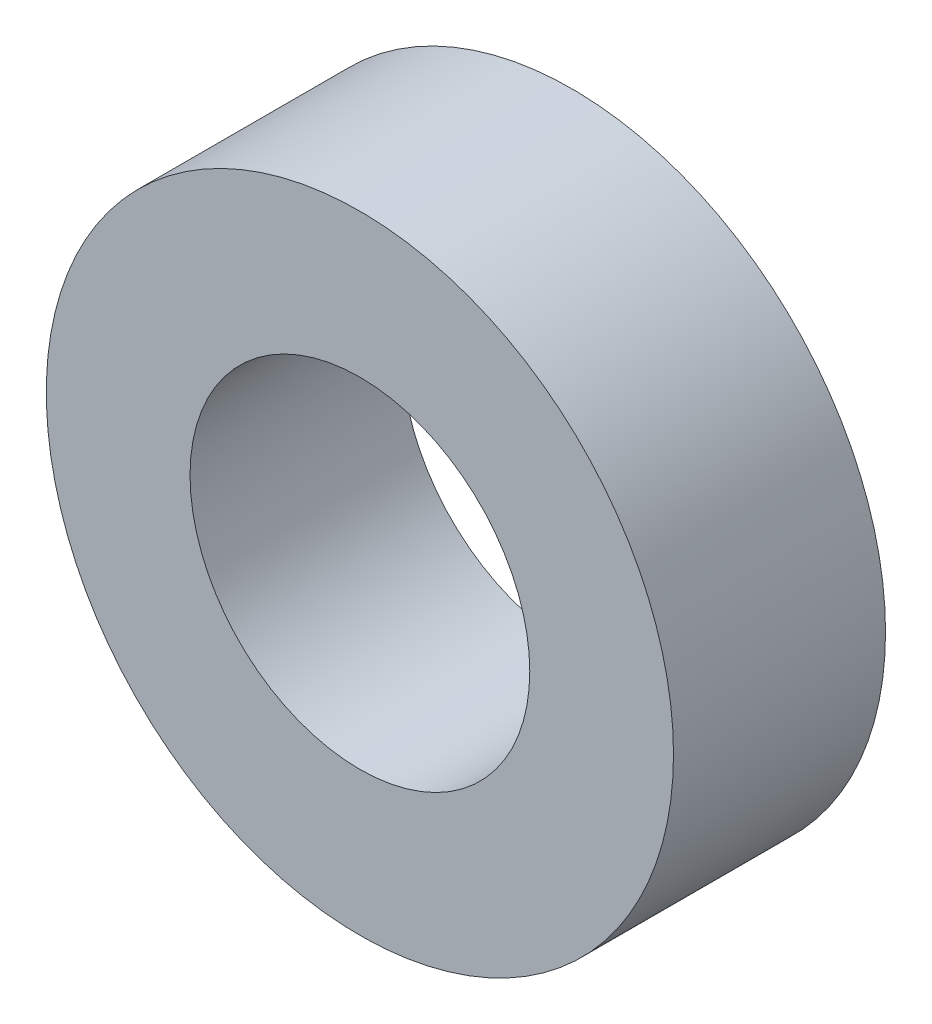
ISO-10303-21;
HEADER;
FILE_DESCRIPTION(('STEP AP214'),'2;1');
FILE_NAME('part.step','',(''),(''),'','','');
FILE_SCHEMA(('AUTOMOTIVE_DESIGN { 1 0 10303 214 1 1 1 1 }'));
ENDSEC;
DATA;
#1=APPLICATION_CONTEXT('core data for automotive mechanical design processes');
#2=APPLICATION_PROTOCOL_DEFINITION('international standard','automotive_design',2000,#1);
#3=PRODUCT_CONTEXT('',#1,'mechanical');
#4=PRODUCT('Part','Part','',(#3));
#5=PRODUCT_RELATED_PRODUCT_CATEGORY('part','',(#4));
#6=PRODUCT_DEFINITION_FORMATION('','',#4);
#7=PRODUCT_DEFINITION_CONTEXT('part definition',#1,'design');
#8=PRODUCT_DEFINITION('design','',#6,#7);
#9=PRODUCT_DEFINITION_SHAPE('','',#8);
#10=(LENGTH_UNIT() NAMED_UNIT(*) SI_UNIT(.MILLI.,.METRE.));
#11=(NAMED_UNIT(*) PLANE_ANGLE_UNIT() SI_UNIT($,.RADIAN.));
#12=(NAMED_UNIT(*) SI_UNIT($,.STERADIAN.) SOLID_ANGLE_UNIT());
#13=UNCERTAINTY_MEASURE_WITH_UNIT(LENGTH_MEASURE(1.E-05),#10,'distance_accuracy_value','');
#14=(GEOMETRIC_REPRESENTATION_CONTEXT(3) GLOBAL_UNCERTAINTY_ASSIGNED_CONTEXT((#13)) GLOBAL_UNIT_ASSIGNED_CONTEXT((#10,
#11,#12)) REPRESENTATION_CONTEXT('',''));
#15=CARTESIAN_POINT('',(0.,0.,0.));
#16=DIRECTION('',(0.,0.,1.));
#17=DIRECTION('',(1.,0.,0.));
#18=AXIS2_PLACEMENT_3D('',#15,#16,#17);
#19=CARTESIAN_POINT('',(0.,0.,2.02825));
#20=DIRECTION('',(0.,0.,1.));
#21=DIRECTION('',(1.,0.,0.));
#22=AXIS2_PLACEMENT_3D('',#19,#20,#21);
#23=PLANE('',#22);
#24=CARTESIAN_POINT('',(0.,0.,2.02825));
#25=DIRECTION('',(0.,0.,1.));
#26=DIRECTION('',(1.,0.,0.));
#27=AXIS2_PLACEMENT_3D('',#24,#25,#26);
#28=CIRCLE('',#27,6.);
#29=CARTESIAN_POINT('',(6.,0.,2.02825));
#30=VERTEX_POINT('',#29);
#31=EDGE_CURVE('E10',#30,#30,#28,.T.);
#32=ORIENTED_EDGE('',*,*,#31,.T.);
#33=EDGE_LOOP('',(#32));
#34=FACE_BOUND('',#33,.T.);
#35=CARTESIAN_POINT('',(0.,0.,2.02825));
#36=DIRECTION('',(0.,0.,1.));
#37=DIRECTION('',(1.,0.,0.));
#38=AXIS2_PLACEMENT_3D('',#35,#36,#37);
#39=CIRCLE('',#38,3.25);
#40=CARTESIAN_POINT('',(3.25,0.,2.02825));
#41=VERTEX_POINT('',#40);
#42=EDGE_CURVE('E49',#41,#41,#39,.T.);
#43=ORIENTED_EDGE('',*,*,#42,.F.);
#44=EDGE_LOOP('',(#43));
#45=FACE_BOUND('',#44,.T.);
#46=ADVANCED_FACE('F39',(#34,#45),#23,.T.);
#47=CARTESIAN_POINT('',(0.,0.,-2.02825));
#48=DIRECTION('',(0.,0.,1.));
#49=DIRECTION('',(1.,0.,0.));
#50=AXIS2_PLACEMENT_3D('',#47,#48,#49);
#51=PLANE('',#50);
#52=CARTESIAN_POINT('',(0.,0.,-2.02825));
#53=DIRECTION('',(0.,0.,1.));
#54=DIRECTION('',(1.,0.,0.));
#55=AXIS2_PLACEMENT_3D('',#52,#53,#54);
#56=CIRCLE('',#55,6.);
#57=CARTESIAN_POINT('',(6.,0.,-2.02825));
#58=VERTEX_POINT('',#57);
#59=EDGE_CURVE('E43',#58,#58,#56,.T.);
#60=ORIENTED_EDGE('',*,*,#59,.F.);
#61=EDGE_LOOP('',(#60));
#62=FACE_BOUND('',#61,.T.);
#63=CARTESIAN_POINT('',(0.,0.,-2.02825));
#64=DIRECTION('',(0.,0.,1.));
#65=DIRECTION('',(1.,0.,0.));
#66=AXIS2_PLACEMENT_3D('',#63,#64,#65);
#67=CIRCLE('',#66,3.25);
#68=CARTESIAN_POINT('',(3.25,0.,-2.02825));
#69=VERTEX_POINT('',#68);
#70=EDGE_CURVE('E55',#69,#69,#67,.T.);
#71=ORIENTED_EDGE('',*,*,#70,.T.);
#72=EDGE_LOOP('',(#71));
#73=FACE_BOUND('',#72,.T.);
#74=ADVANCED_FACE('F65',(#62,#73),#51,.F.);
#75=CARTESIAN_POINT('',(0.,0.,2.02825));
#76=DIRECTION('',(0.,0.,-1.));
#77=DIRECTION('',(-1.,0.,0.));
#78=AXIS2_PLACEMENT_3D('',#75,#76,#77);
#79=CYLINDRICAL_SURFACE('',#78,6.);
#80=ORIENTED_EDGE('',*,*,#31,.F.);
#81=EDGE_LOOP('',(#80));
#82=FACE_BOUND('',#81,.T.);
#83=ORIENTED_EDGE('',*,*,#59,.T.);
#84=EDGE_LOOP('',(#83));
#85=FACE_BOUND('',#84,.T.);
#86=ADVANCED_FACE('F41',(#82,#85),#79,.T.);
#87=CARTESIAN_POINT('',(0.,0.,2.02825));
#88=DIRECTION('',(0.,0.,-1.));
#89=DIRECTION('',(-1.,0.,0.));
#90=AXIS2_PLACEMENT_3D('',#87,#88,#89);
#91=CYLINDRICAL_SURFACE('',#90,3.25);
#92=ORIENTED_EDGE('',*,*,#42,.T.);
#93=EDGE_LOOP('',(#92));
#94=FACE_BOUND('',#93,.T.);
#95=ORIENTED_EDGE('',*,*,#70,.F.);
#96=EDGE_LOOP('',(#95));
#97=FACE_BOUND('',#96,.T.);
#98=ADVANCED_FACE('F59',(#94,#97),#91,.F.);
#99=CLOSED_SHELL('',(#46,#74,#86,#98));
#100=MANIFOLD_SOLID_BREP('B2',#99);
#101=ADVANCED_BREP_SHAPE_REPRESENTATION('',(#18,#100),#14);
#102=SHAPE_DEFINITION_REPRESENTATION(#9,#101);
ENDSEC;
END-ISO-10303-21;
